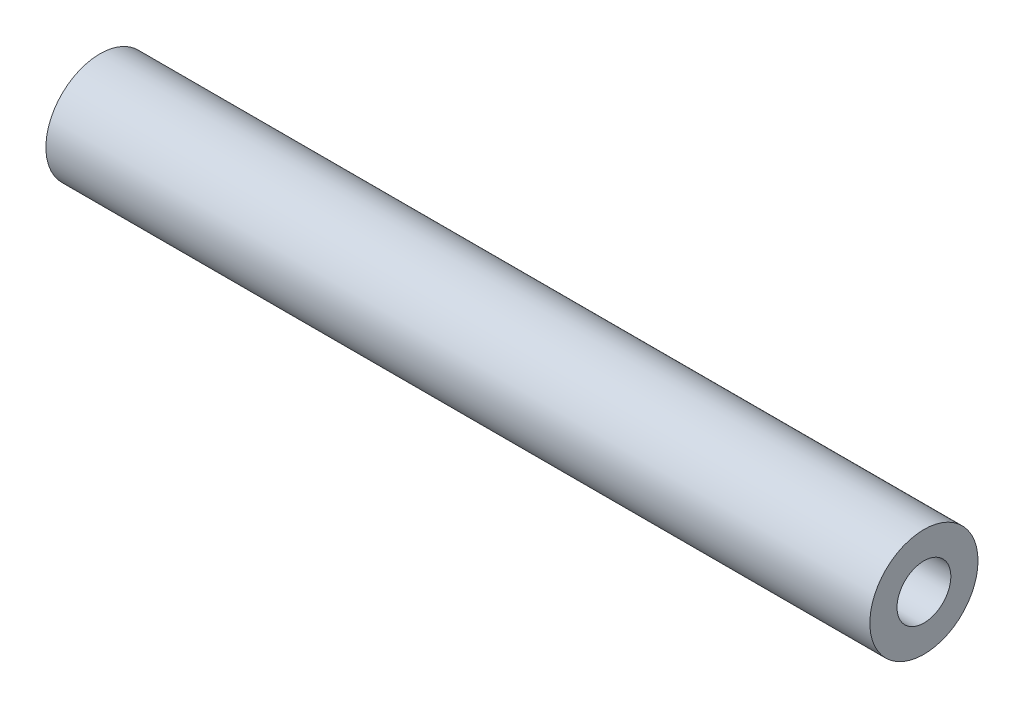
ISO-10303-21;
HEADER;
FILE_DESCRIPTION(('STEP AP214'),'2;1');
FILE_NAME('part.step','',(''),(''),'','','');
FILE_SCHEMA(('AUTOMOTIVE_DESIGN { 1 0 10303 214 1 1 1 1 }'));
ENDSEC;
DATA;
#1=APPLICATION_CONTEXT('core data for automotive mechanical design processes');
#2=APPLICATION_PROTOCOL_DEFINITION('international standard','automotive_design',2000,#1);
#3=PRODUCT_CONTEXT('',#1,'mechanical');
#4=PRODUCT('Part','Part','',(#3));
#5=PRODUCT_RELATED_PRODUCT_CATEGORY('part','',(#4));
#6=PRODUCT_DEFINITION_FORMATION('','',#4);
#7=PRODUCT_DEFINITION_CONTEXT('part definition',#1,'design');
#8=PRODUCT_DEFINITION('design','',#6,#7);
#9=PRODUCT_DEFINITION_SHAPE('','',#8);
#10=(LENGTH_UNIT() NAMED_UNIT(*) SI_UNIT(.MILLI.,.METRE.));
#11=(NAMED_UNIT(*) PLANE_ANGLE_UNIT() SI_UNIT($,.RADIAN.));
#12=(NAMED_UNIT(*) SI_UNIT($,.STERADIAN.) SOLID_ANGLE_UNIT());
#13=UNCERTAINTY_MEASURE_WITH_UNIT(LENGTH_MEASURE(1.E-05),#10,'distance_accuracy_value','');
#14=(GEOMETRIC_REPRESENTATION_CONTEXT(3) GLOBAL_UNCERTAINTY_ASSIGNED_CONTEXT((#13)) GLOBAL_UNIT_ASSIGNED_CONTEXT((#10,
#11,#12)) REPRESENTATION_CONTEXT('',''));
#15=CARTESIAN_POINT('',(0.,0.,0.));
#16=DIRECTION('',(0.,0.,1.));
#17=DIRECTION('',(1.,0.,0.));
#18=AXIS2_PLACEMENT_3D('',#15,#16,#17);
#19=CARTESIAN_POINT('',(19.125,0.,0.));
#20=DIRECTION('',(1.,0.,0.));
#21=DIRECTION('',(0.,0.,-1.));
#22=AXIS2_PLACEMENT_3D('',#19,#20,#21);
#23=PLANE('',#22);
#24=CARTESIAN_POINT('',(19.125,0.,0.));
#25=DIRECTION('',(1.,0.,0.));
#26=DIRECTION('',(0.,0.,-1.));
#27=AXIS2_PLACEMENT_3D('',#24,#25,#26);
#28=CIRCLE('',#27,1.25);
#29=CARTESIAN_POINT('',(19.125,0.,-1.25));
#30=VERTEX_POINT('',#29);
#31=EDGE_CURVE('E54',#30,#30,#28,.T.);
#32=ORIENTED_EDGE('',*,*,#31,.F.);
#33=EDGE_LOOP('',(#32));
#34=FACE_BOUND('',#33,.T.);
#35=CARTESIAN_POINT('',(19.125,0.,0.));
#36=DIRECTION('',(1.,0.,0.));
#37=DIRECTION('',(0.,0.,-1.));
#38=AXIS2_PLACEMENT_3D('',#35,#36,#37);
#39=CIRCLE('',#38,2.51);
#40=CARTESIAN_POINT('',(19.125,0.,-2.51));
#41=VERTEX_POINT('',#40);
#42=EDGE_CURVE('E10',#41,#41,#39,.T.);
#43=ORIENTED_EDGE('',*,*,#42,.T.);
#44=EDGE_LOOP('',(#43));
#45=FACE_BOUND('',#44,.T.);
#46=ADVANCED_FACE('F32',(#34,#45),#23,.T.);
#47=CARTESIAN_POINT('',(-19.125,0.,0.));
#48=DIRECTION('',(1.,0.,0.));
#49=DIRECTION('',(0.,0.,-1.));
#50=AXIS2_PLACEMENT_3D('',#47,#48,#49);
#51=PLANE('',#50);
#52=CARTESIAN_POINT('',(-19.125,0.,0.));
#53=DIRECTION('',(-1.,0.,0.));
#54=DIRECTION('',(0.,0.,1.));
#55=AXIS2_PLACEMENT_3D('',#52,#53,#54);
#56=CIRCLE('',#55,1.25);
#57=CARTESIAN_POINT('',(-19.125,0.,1.25));
#58=VERTEX_POINT('',#57);
#59=EDGE_CURVE('E65',#58,#58,#56,.T.);
#60=ORIENTED_EDGE('',*,*,#59,.F.);
#61=EDGE_LOOP('',(#60));
#62=FACE_BOUND('',#61,.T.);
#63=CARTESIAN_POINT('',(-19.125,0.,0.));
#64=DIRECTION('',(1.,0.,0.));
#65=DIRECTION('',(0.,0.,-1.));
#66=AXIS2_PLACEMENT_3D('',#63,#64,#65);
#67=CIRCLE('',#66,2.51);
#68=CARTESIAN_POINT('',(-19.125,0.,-2.51));
#69=VERTEX_POINT('',#68);
#70=EDGE_CURVE('E40',#69,#69,#67,.T.);
#71=ORIENTED_EDGE('',*,*,#70,.F.);
#72=EDGE_LOOP('',(#71));
#73=FACE_BOUND('',#72,.T.);
#74=ADVANCED_FACE('F71',(#62,#73),#51,.F.);
#75=CARTESIAN_POINT('',(19.125,0.,0.));
#76=DIRECTION('',(-1.,0.,0.));
#77=DIRECTION('',(0.,0.,1.));
#78=AXIS2_PLACEMENT_3D('',#75,#76,#77);
#79=CYLINDRICAL_SURFACE('',#78,2.51);
#80=ORIENTED_EDGE('',*,*,#42,.F.);
#81=EDGE_LOOP('',(#80));
#82=FACE_BOUND('',#81,.T.);
#83=ORIENTED_EDGE('',*,*,#70,.T.);
#84=EDGE_LOOP('',(#83));
#85=FACE_BOUND('',#84,.T.);
#86=ADVANCED_FACE('F34',(#82,#85),#79,.T.);
#87=CARTESIAN_POINT('',(19.125,0.,0.));
#88=DIRECTION('',(-1.,0.,0.));
#89=DIRECTION('',(0.,0.,1.));
#90=AXIS2_PLACEMENT_3D('',#87,#88,#89);
#91=CYLINDRICAL_SURFACE('',#90,1.);
#92=CARTESIAN_POINT('',(-10.9747848452431,0.,0.));
#93=DIRECTION('',(-1.,0.,0.));
#94=DIRECTION('',(0.,0.,1.));
#95=AXIS2_PLACEMENT_3D('',#92,#93,#94);
#96=CIRCLE('',#95,1.);
#97=CARTESIAN_POINT('',(-10.9747848452431,0.,1.));
#98=VERTEX_POINT('',#97);
#99=EDGE_CURVE('E36',#98,#98,#96,.F.);
#100=ORIENTED_EDGE('',*,*,#99,.F.);
#101=EDGE_LOOP('',(#100));
#102=FACE_BOUND('',#101,.T.);
#103=CARTESIAN_POINT('',(10.9747848452431,0.,0.));
#104=DIRECTION('',(1.,0.,0.));
#105=DIRECTION('',(0.,0.,-1.));
#106=AXIS2_PLACEMENT_3D('',#103,#104,#105);
#107=CIRCLE('',#106,1.);
#108=CARTESIAN_POINT('',(10.9747848452431,0.,-1.));
#109=VERTEX_POINT('',#108);
#110=EDGE_CURVE('E45',#109,#109,#107,.F.);
#111=ORIENTED_EDGE('',*,*,#110,.F.);
#112=EDGE_LOOP('',(#111));
#113=FACE_BOUND('',#112,.T.);
#114=ADVANCED_FACE('F77',(#102,#113),#91,.F.);
#115=CARTESIAN_POINT('',(11.125,0.,0.));
#116=DIRECTION('',(1.,0.,0.));
#117=DIRECTION('',(0.,0.,-1.));
#118=AXIS2_PLACEMENT_3D('',#115,#116,#117);
#119=CONICAL_SURFACE('',#118,1.25,1.02974425867665);
#120=ORIENTED_EDGE('',*,*,#110,.T.);
#121=EDGE_LOOP('',(#120));
#122=FACE_BOUND('',#121,.T.);
#123=CARTESIAN_POINT('',(11.125,0.,0.));
#124=DIRECTION('',(1.,0.,0.));
#125=DIRECTION('',(0.,0.,-1.));
#126=AXIS2_PLACEMENT_3D('',#123,#124,#125);
#127=CIRCLE('',#126,1.25);
#128=CARTESIAN_POINT('',(11.125,0.,-1.25));
#129=VERTEX_POINT('',#128);
#130=EDGE_CURVE('E48',#129,#129,#127,.T.);
#131=ORIENTED_EDGE('',*,*,#130,.T.);
#132=EDGE_LOOP('',(#131));
#133=FACE_BOUND('',#132,.T.);
#134=ADVANCED_FACE('F82',(#122,#133),#119,.F.);
#135=CARTESIAN_POINT('',(19.125,0.,0.));
#136=DIRECTION('',(1.,0.,0.));
#137=DIRECTION('',(0.,0.,-1.));
#138=AXIS2_PLACEMENT_3D('',#135,#136,#137);
#139=CYLINDRICAL_SURFACE('',#138,1.25);
#140=ORIENTED_EDGE('',*,*,#130,.F.);
#141=EDGE_LOOP('',(#140));
#142=FACE_BOUND('',#141,.T.);
#143=ORIENTED_EDGE('',*,*,#31,.T.);
#144=EDGE_LOOP('',(#143));
#145=FACE_BOUND('',#144,.T.);
#146=ADVANCED_FACE('F93',(#142,#145),#139,.F.);
#147=CARTESIAN_POINT('',(-11.125,0.,0.));
#148=DIRECTION('',(-1.,0.,0.));
#149=DIRECTION('',(0.,0.,1.));
#150=AXIS2_PLACEMENT_3D('',#147,#148,#149);
#151=CONICAL_SURFACE('',#150,1.25,1.02974425867665);
#152=ORIENTED_EDGE('',*,*,#99,.T.);
#153=EDGE_LOOP('',(#152));
#154=FACE_BOUND('',#153,.T.);
#155=CARTESIAN_POINT('',(-11.125,0.,0.));
#156=DIRECTION('',(-1.,0.,0.));
#157=DIRECTION('',(0.,0.,1.));
#158=AXIS2_PLACEMENT_3D('',#155,#156,#157);
#159=CIRCLE('',#158,1.25);
#160=CARTESIAN_POINT('',(-11.125,0.,1.25));
#161=VERTEX_POINT('',#160);
#162=EDGE_CURVE('E61',#161,#161,#159,.T.);
#163=ORIENTED_EDGE('',*,*,#162,.T.);
#164=EDGE_LOOP('',(#163));
#165=FACE_BOUND('',#164,.T.);
#166=ADVANCED_FACE('F96',(#154,#165),#151,.F.);
#167=CARTESIAN_POINT('',(-19.125,0.,0.));
#168=DIRECTION('',(-1.,0.,0.));
#169=DIRECTION('',(0.,0.,1.));
#170=AXIS2_PLACEMENT_3D('',#167,#168,#169);
#171=CYLINDRICAL_SURFACE('',#170,1.25);
#172=ORIENTED_EDGE('',*,*,#162,.F.);
#173=EDGE_LOOP('',(#172));
#174=FACE_BOUND('',#173,.T.);
#175=ORIENTED_EDGE('',*,*,#59,.T.);
#176=EDGE_LOOP('',(#175));
#177=FACE_BOUND('',#176,.T.);
#178=ADVANCED_FACE('F69',(#174,#177),#171,.F.);
#179=CLOSED_SHELL('',(#46,#74,#86,#114,#134,#146,#166,#178));
#180=MANIFOLD_SOLID_BREP('B2',#179);
#181=ADVANCED_BREP_SHAPE_REPRESENTATION('',(#18,#180),#14);
#182=SHAPE_DEFINITION_REPRESENTATION(#9,#181);
ENDSEC;
END-ISO-10303-21;
